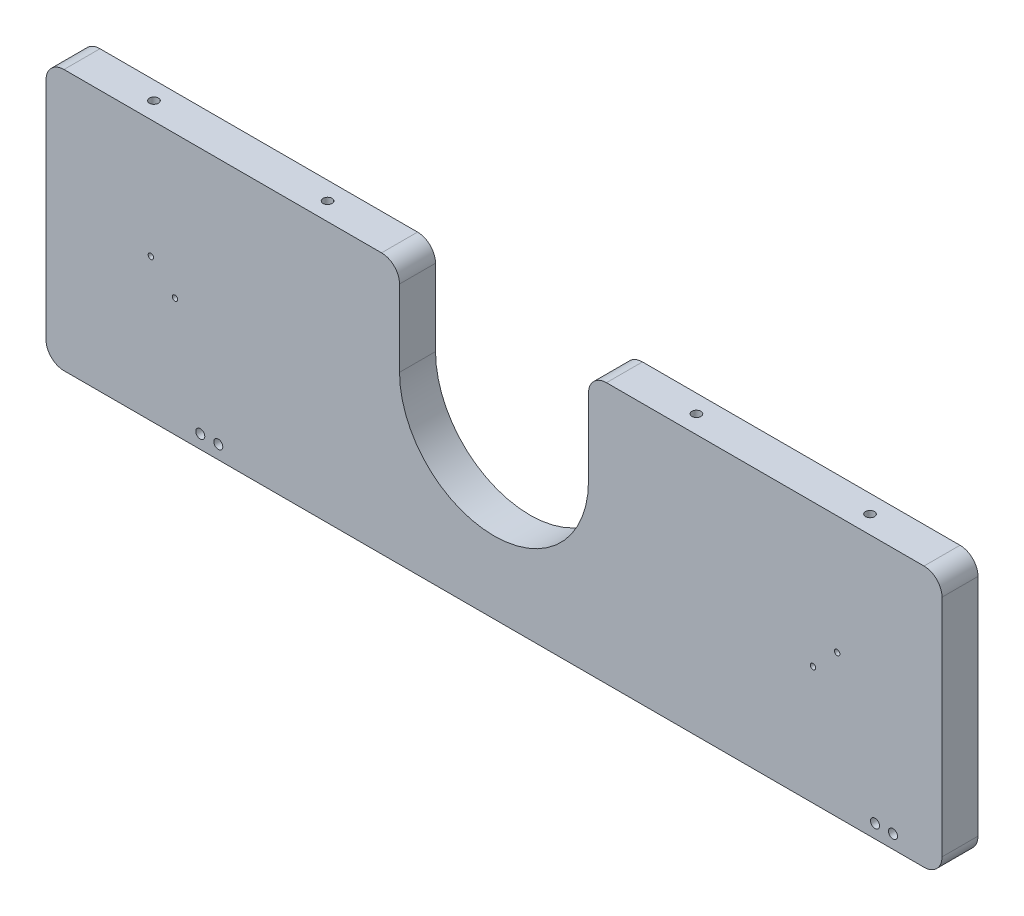
ISO-10303-21;
HEADER;
FILE_DESCRIPTION(('STEP AP214'),'2;1');
FILE_NAME('part.step','',(''),(''),'','','');
FILE_SCHEMA(('AUTOMOTIVE_DESIGN { 1 0 10303 214 1 1 1 1 }'));
ENDSEC;
DATA;
#1=APPLICATION_CONTEXT('core data for automotive mechanical design processes');
#2=APPLICATION_PROTOCOL_DEFINITION('international standard','automotive_design',2000,#1);
#3=PRODUCT_CONTEXT('',#1,'mechanical');
#4=PRODUCT('Part','Part','',(#3));
#5=PRODUCT_RELATED_PRODUCT_CATEGORY('part','',(#4));
#6=PRODUCT_DEFINITION_FORMATION('','',#4);
#7=PRODUCT_DEFINITION_CONTEXT('part definition',#1,'design');
#8=PRODUCT_DEFINITION('design','',#6,#7);
#9=PRODUCT_DEFINITION_SHAPE('','',#8);
#10=(LENGTH_UNIT() NAMED_UNIT(*) SI_UNIT(.MILLI.,.METRE.));
#11=(NAMED_UNIT(*) PLANE_ANGLE_UNIT() SI_UNIT($,.RADIAN.));
#12=(NAMED_UNIT(*) SI_UNIT($,.STERADIAN.) SOLID_ANGLE_UNIT());
#13=UNCERTAINTY_MEASURE_WITH_UNIT(LENGTH_MEASURE(1.E-05),#10,'distance_accuracy_value','');
#14=(GEOMETRIC_REPRESENTATION_CONTEXT(3) GLOBAL_UNCERTAINTY_ASSIGNED_CONTEXT((#13)) GLOBAL_UNIT_ASSIGNED_CONTEXT((#10,
#11,#12)) REPRESENTATION_CONTEXT('',''));
#15=CARTESIAN_POINT('',(0.,0.,0.));
#16=DIRECTION('',(0.,0.,1.));
#17=DIRECTION('',(1.,0.,0.));
#18=AXIS2_PLACEMENT_3D('',#15,#16,#17);
#19=CARTESIAN_POINT('',(0.,-31.7184116529096,20.));
#20=DIRECTION('',(0.,0.,1.));
#21=DIRECTION('',(1.,0.,0.));
#22=AXIS2_PLACEMENT_3D('',#19,#20,#21);
#23=PLANE('',#22);
#24=CARTESIAN_POINT('',(177.282485578728,-58.4359260741818,20.));
#25=DIRECTION('',(0.,0.,1.));
#26=DIRECTION('',(-1.,0.,0.));
#27=AXIS2_PLACEMENT_3D('',#24,#25,#26);
#28=CIRCLE('',#27,1.49999999999999);
#29=CARTESIAN_POINT('',(175.782485578728,-58.4359260741818,20.));
#30=VERTEX_POINT('',#29);
#31=EDGE_CURVE('E322',#30,#30,#28,.T.);
#32=ORIENTED_EDGE('',*,*,#31,.F.);
#33=EDGE_LOOP('',(#32));
#34=FACE_BOUND('',#33,.T.);
#35=CARTESIAN_POINT('',(190.717514421272,-45.0008972316374,20.));
#36=DIRECTION('',(0.,0.,1.));
#37=DIRECTION('',(-1.,0.,0.));
#38=AXIS2_PLACEMENT_3D('',#35,#36,#37);
#39=CIRCLE('',#38,1.50000000000002);
#40=CARTESIAN_POINT('',(189.217514421272,-45.0008972316374,20.));
#41=VERTEX_POINT('',#40);
#42=EDGE_CURVE('E321',#41,#41,#39,.T.);
#43=ORIENTED_EDGE('',*,*,#42,.F.);
#44=EDGE_LOOP('',(#43));
#45=FACE_BOUND('',#44,.T.);
#46=CARTESIAN_POINT('',(-190.717514421272,-45.0008972316375,20.));
#47=DIRECTION('',(0.,0.,1.));
#48=DIRECTION('',(1.,0.,0.));
#49=AXIS2_PLACEMENT_3D('',#46,#47,#48);
#50=CIRCLE('',#49,1.50000000000002);
#51=CARTESIAN_POINT('',(-189.217514421272,-45.0008972316375,20.));
#52=VERTEX_POINT('',#51);
#53=EDGE_CURVE('E329',#52,#52,#50,.T.);
#54=ORIENTED_EDGE('',*,*,#53,.F.);
#55=EDGE_LOOP('',(#54));
#56=FACE_BOUND('',#55,.T.);
#57=CARTESIAN_POINT('',(-177.282485578728,-58.4359260741819,20.));
#58=DIRECTION('',(0.,0.,1.));
#59=DIRECTION('',(1.,0.,0.));
#60=AXIS2_PLACEMENT_3D('',#57,#58,#59);
#61=CIRCLE('',#60,1.49999999999999);
#62=CARTESIAN_POINT('',(-175.782485578728,-58.4359260741819,20.));
#63=VERTEX_POINT('',#62);
#64=EDGE_CURVE('E314',#63,#63,#61,.T.);
#65=ORIENTED_EDGE('',*,*,#64,.F.);
#66=EDGE_LOOP('',(#65));
#67=FACE_BOUND('',#66,.T.);
#68=CARTESIAN_POINT('',(221.75,-116.71841165291,20.));
#69=DIRECTION('',(0.,0.,1.));
#70=DIRECTION('',(1.,0.,0.));
#71=AXIS2_PLACEMENT_3D('',#68,#69,#70);
#72=CIRCLE('',#71,2.5);
#73=CARTESIAN_POINT('',(224.25,-116.71841165291,20.));
#74=VERTEX_POINT('',#73);
#75=EDGE_CURVE('E297',#74,#74,#72,.T.);
#76=ORIENTED_EDGE('',*,*,#75,.F.);
#77=EDGE_LOOP('',(#76));
#78=FACE_BOUND('',#77,.T.);
#79=CARTESIAN_POINT('',(-163.25,-116.71841165291,20.));
#80=DIRECTION('',(0.,0.,1.));
#81=DIRECTION('',(1.,0.,0.));
#82=AXIS2_PLACEMENT_3D('',#79,#80,#81);
#83=CIRCLE('',#82,2.49999999999999);
#84=CARTESIAN_POINT('',(-160.75,-116.71841165291,20.));
#85=VERTEX_POINT('',#84);
#86=EDGE_CURVE('E181',#85,#85,#83,.T.);
#87=ORIENTED_EDGE('',*,*,#86,.F.);
#88=EDGE_LOOP('',(#87));
#89=FACE_BOUND('',#88,.T.);
#90=DIRECTION('',(0.,1.,0.));
#91=VECTOR('',#90,1.);
#92=CARTESIAN_POINT('',(249.,-124.21841165291,20.));
#93=LINE('',#92,#91);
#94=CARTESIAN_POINT('',(249.,-114.21841165291,20.));
#95=VERTEX_POINT('',#94);
#96=CARTESIAN_POINT('',(249.,10.7815883470904,20.));
#97=VERTEX_POINT('',#96);
#98=EDGE_CURVE('E197',#95,#97,#93,.T.);
#99=ORIENTED_EDGE('',*,*,#98,.T.);
#100=CARTESIAN_POINT('',(239.,10.7815883470904,20.));
#101=DIRECTION('',(0.,0.,1.));
#102=DIRECTION('',(1.,0.,0.));
#103=AXIS2_PLACEMENT_3D('',#100,#101,#102);
#104=CIRCLE('',#103,10.);
#105=CARTESIAN_POINT('',(239.,20.7815883470904,20.));
#106=VERTEX_POINT('',#105);
#107=EDGE_CURVE('E237',#97,#106,#104,.T.);
#108=ORIENTED_EDGE('',*,*,#107,.T.);
#109=DIRECTION('',(-1.,0.,0.));
#110=VECTOR('',#109,1.);
#111=CARTESIAN_POINT('',(52.5,20.7815883470904,20.));
#112=LINE('',#111,#110);
#113=CARTESIAN_POINT('',(62.5,20.7815883470904,20.));
#114=VERTEX_POINT('',#113);
#115=EDGE_CURVE('E150',#106,#114,#112,.T.);
#116=ORIENTED_EDGE('',*,*,#115,.T.);
#117=CARTESIAN_POINT('',(62.5,10.7815883470904,20.));
#118=DIRECTION('',(0.,0.,1.));
#119=DIRECTION('',(1.,0.,0.));
#120=AXIS2_PLACEMENT_3D('',#117,#118,#119);
#121=CIRCLE('',#120,10.);
#122=CARTESIAN_POINT('',(52.5,10.7815883470904,20.));
#123=VERTEX_POINT('',#122);
#124=EDGE_CURVE('E146',#114,#123,#121,.T.);
#125=ORIENTED_EDGE('',*,*,#124,.T.);
#126=DIRECTION('',(0.,-1.,0.));
#127=VECTOR('',#126,1.);
#128=CARTESIAN_POINT('',(52.5,-31.7184116529096,20.));
#129=LINE('',#128,#127);
#130=CARTESIAN_POINT('',(52.5,-31.7184116529096,20.));
#131=VERTEX_POINT('',#130);
#132=EDGE_CURVE('E137',#123,#131,#129,.T.);
#133=ORIENTED_EDGE('',*,*,#132,.T.);
#134=CARTESIAN_POINT('',(0.,-31.7184116529096,20.));
#135=DIRECTION('',(0.,0.,-1.));
#136=DIRECTION('',(1.,0.,0.));
#137=AXIS2_PLACEMENT_3D('',#134,#135,#136);
#138=CIRCLE('',#137,52.5);
#139=CARTESIAN_POINT('',(-52.5,-31.7184116529096,20.));
#140=VERTEX_POINT('',#139);
#141=EDGE_CURVE('E142',#131,#140,#138,.T.);
#142=ORIENTED_EDGE('',*,*,#141,.T.);
#143=DIRECTION('',(0.,1.,0.));
#144=VECTOR('',#143,1.);
#145=CARTESIAN_POINT('',(-52.5,-31.7184116529096,20.));
#146=LINE('',#145,#144);
#147=CARTESIAN_POINT('',(-52.5,10.7815883470904,20.));
#148=VERTEX_POINT('',#147);
#149=EDGE_CURVE('E165',#140,#148,#146,.T.);
#150=ORIENTED_EDGE('',*,*,#149,.T.);
#151=CARTESIAN_POINT('',(-62.5,10.7815883470904,20.));
#152=DIRECTION('',(0.,0.,1.));
#153=DIRECTION('',(1.,0.,0.));
#154=AXIS2_PLACEMENT_3D('',#151,#152,#153);
#155=CIRCLE('',#154,10.);
#156=CARTESIAN_POINT('',(-62.5000000000001,20.7815883470904,20.));
#157=VERTEX_POINT('',#156);
#158=EDGE_CURVE('E59',#148,#157,#155,.T.);
#159=ORIENTED_EDGE('',*,*,#158,.T.);
#160=DIRECTION('',(-1.,0.,0.));
#161=VECTOR('',#160,1.);
#162=CARTESIAN_POINT('',(-249.,20.7815883470903,20.));
#163=LINE('',#162,#161);
#164=CARTESIAN_POINT('',(-239.,20.7815883470903,20.));
#165=VERTEX_POINT('',#164);
#166=EDGE_CURVE('E167',#157,#165,#163,.T.);
#167=ORIENTED_EDGE('',*,*,#166,.T.);
#168=CARTESIAN_POINT('',(-239.,10.7815883470903,20.));
#169=DIRECTION('',(0.,0.,1.));
#170=DIRECTION('',(1.,0.,0.));
#171=AXIS2_PLACEMENT_3D('',#168,#169,#170);
#172=CIRCLE('',#171,10.);
#173=CARTESIAN_POINT('',(-249.,10.7815883470903,20.));
#174=VERTEX_POINT('',#173);
#175=EDGE_CURVE('E235',#165,#174,#172,.T.);
#176=ORIENTED_EDGE('',*,*,#175,.T.);
#177=DIRECTION('',(0.,-1.,0.));
#178=VECTOR('',#177,1.);
#179=CARTESIAN_POINT('',(-249.,-124.21841165291,20.));
#180=LINE('',#179,#178);
#181=CARTESIAN_POINT('',(-249.,-114.21841165291,20.));
#182=VERTEX_POINT('',#181);
#183=EDGE_CURVE('E172',#174,#182,#180,.T.);
#184=ORIENTED_EDGE('',*,*,#183,.T.);
#185=CARTESIAN_POINT('',(-239.,-114.21841165291,20.));
#186=DIRECTION('',(0.,0.,1.));
#187=DIRECTION('',(1.,0.,0.));
#188=AXIS2_PLACEMENT_3D('',#185,#186,#187);
#189=CIRCLE('',#188,10.);
#190=CARTESIAN_POINT('',(-239.,-124.21841165291,20.));
#191=VERTEX_POINT('',#190);
#192=EDGE_CURVE('E213',#182,#191,#189,.T.);
#193=ORIENTED_EDGE('',*,*,#192,.T.);
#194=DIRECTION('',(1.,0.,0.));
#195=VECTOR('',#194,1.);
#196=CARTESIAN_POINT('',(-249.,-124.21841165291,20.));
#197=LINE('',#196,#195);
#198=CARTESIAN_POINT('',(239.,-124.21841165291,20.));
#199=VERTEX_POINT('',#198);
#200=EDGE_CURVE('E174',#191,#199,#197,.T.);
#201=ORIENTED_EDGE('',*,*,#200,.T.);
#202=CARTESIAN_POINT('',(239.,-114.21841165291,20.));
#203=DIRECTION('',(0.,0.,1.));
#204=DIRECTION('',(1.,0.,0.));
#205=AXIS2_PLACEMENT_3D('',#202,#203,#204);
#206=CIRCLE('',#205,10.);
#207=EDGE_CURVE('E211',#199,#95,#206,.T.);
#208=ORIENTED_EDGE('',*,*,#207,.T.);
#209=EDGE_LOOP('',(#99,#108,#116,#125,#133,#142,#150,#159,#167,#176,#184,#193,#201,#208));
#210=FACE_BOUND('',#209,.T.);
#211=CARTESIAN_POINT('',(-153.25,-116.71841165291,20.));
#212=DIRECTION('',(0.,0.,1.));
#213=DIRECTION('',(1.,0.,0.));
#214=AXIS2_PLACEMENT_3D('',#211,#212,#213);
#215=CIRCLE('',#214,2.5);
#216=CARTESIAN_POINT('',(-150.75,-116.71841165291,20.));
#217=VERTEX_POINT('',#216);
#218=EDGE_CURVE('E291',#217,#217,#215,.T.);
#219=ORIENTED_EDGE('',*,*,#218,.F.);
#220=EDGE_LOOP('',(#219));
#221=FACE_BOUND('',#220,.T.);
#222=CARTESIAN_POINT('',(211.75,-116.71841165291,20.));
#223=DIRECTION('',(0.,0.,1.));
#224=DIRECTION('',(1.,0.,0.));
#225=AXIS2_PLACEMENT_3D('',#222,#223,#224);
#226=CIRCLE('',#225,2.5);
#227=CARTESIAN_POINT('',(214.25,-116.71841165291,20.));
#228=VERTEX_POINT('',#227);
#229=EDGE_CURVE('E303',#228,#228,#226,.T.);
#230=ORIENTED_EDGE('',*,*,#229,.F.);
#231=EDGE_LOOP('',(#230));
#232=FACE_BOUND('',#231,.T.);
#233=ADVANCED_FACE('F37',(#34,#45,#56,#67,#78,#89,#210,#221,#232),#23,.T.);
#234=CARTESIAN_POINT('',(0.,-31.7184116529096,0.));
#235=DIRECTION('',(0.,0.,1.));
#236=DIRECTION('',(1.,0.,0.));
#237=AXIS2_PLACEMENT_3D('',#234,#235,#236);
#238=PLANE('',#237);
#239=CARTESIAN_POINT('',(177.282485578728,-58.4359260741818,0.));
#240=DIRECTION('',(0.,0.,1.));
#241=DIRECTION('',(1.,0.,0.));
#242=AXIS2_PLACEMENT_3D('',#239,#240,#241);
#243=CIRCLE('',#242,1.49999999999999);
#244=CARTESIAN_POINT('',(178.782485578728,-58.4359260741818,0.));
#245=VERTEX_POINT('',#244);
#246=EDGE_CURVE('E318',#245,#245,#243,.F.);
#247=ORIENTED_EDGE('',*,*,#246,.F.);
#248=EDGE_LOOP('',(#247));
#249=FACE_BOUND('',#248,.T.);
#250=CARTESIAN_POINT('',(190.717514421272,-45.0008972316374,0.));
#251=DIRECTION('',(0.,0.,1.));
#252=DIRECTION('',(1.,0.,0.));
#253=AXIS2_PLACEMENT_3D('',#250,#251,#252);
#254=CIRCLE('',#253,1.50000000000002);
#255=CARTESIAN_POINT('',(192.217514421272,-45.0008972316374,0.));
#256=VERTEX_POINT('',#255);
#257=EDGE_CURVE('E326',#256,#256,#254,.F.);
#258=ORIENTED_EDGE('',*,*,#257,.F.);
#259=EDGE_LOOP('',(#258));
#260=FACE_BOUND('',#259,.T.);
#261=CARTESIAN_POINT('',(-190.717514421272,-45.0008972316375,0.));
#262=DIRECTION('',(0.,0.,1.));
#263=DIRECTION('',(1.,0.,0.));
#264=AXIS2_PLACEMENT_3D('',#261,#262,#263);
#265=CIRCLE('',#264,1.50000000000002);
#266=CARTESIAN_POINT('',(-189.217514421272,-45.0008972316375,0.));
#267=VERTEX_POINT('',#266);
#268=EDGE_CURVE('E317',#267,#267,#265,.F.);
#269=ORIENTED_EDGE('',*,*,#268,.F.);
#270=EDGE_LOOP('',(#269));
#271=FACE_BOUND('',#270,.T.);
#272=CARTESIAN_POINT('',(-177.282485578728,-58.4359260741819,0.));
#273=DIRECTION('',(0.,0.,1.));
#274=DIRECTION('',(1.,0.,0.));
#275=AXIS2_PLACEMENT_3D('',#272,#273,#274);
#276=CIRCLE('',#275,1.49999999999999);
#277=CARTESIAN_POINT('',(-175.782485578728,-58.4359260741819,0.));
#278=VERTEX_POINT('',#277);
#279=EDGE_CURVE('E309',#278,#278,#276,.F.);
#280=ORIENTED_EDGE('',*,*,#279,.F.);
#281=EDGE_LOOP('',(#280));
#282=FACE_BOUND('',#281,.T.);
#283=DIRECTION('',(-1.,0.,0.));
#284=VECTOR('',#283,1.);
#285=CARTESIAN_POINT('',(52.5,20.7815883470904,0.));
#286=LINE('',#285,#284);
#287=CARTESIAN_POINT('',(239.,20.7815883470904,0.));
#288=VERTEX_POINT('',#287);
#289=CARTESIAN_POINT('',(62.5,20.7815883470904,0.));
#290=VERTEX_POINT('',#289);
#291=EDGE_CURVE('E180',#288,#290,#286,.T.);
#292=ORIENTED_EDGE('',*,*,#291,.F.);
#293=CARTESIAN_POINT('',(239.,10.7815883470904,0.));
#294=DIRECTION('',(0.,0.,1.));
#295=DIRECTION('',(1.,0.,0.));
#296=AXIS2_PLACEMENT_3D('',#293,#294,#295);
#297=CIRCLE('',#296,10.);
#298=CARTESIAN_POINT('',(249.,10.7815883470904,0.));
#299=VERTEX_POINT('',#298);
#300=EDGE_CURVE('E229',#288,#299,#297,.F.);
#301=ORIENTED_EDGE('',*,*,#300,.T.);
#302=DIRECTION('',(0.,1.,0.));
#303=VECTOR('',#302,1.);
#304=CARTESIAN_POINT('',(249.,-124.21841165291,0.));
#305=LINE('',#304,#303);
#306=CARTESIAN_POINT('',(249.,-114.21841165291,0.));
#307=VERTEX_POINT('',#306);
#308=EDGE_CURVE('E177',#307,#299,#305,.T.);
#309=ORIENTED_EDGE('',*,*,#308,.F.);
#310=CARTESIAN_POINT('',(239.,-114.21841165291,0.));
#311=DIRECTION('',(0.,0.,1.));
#312=DIRECTION('',(1.,0.,0.));
#313=AXIS2_PLACEMENT_3D('',#310,#311,#312);
#314=CIRCLE('',#313,10.);
#315=CARTESIAN_POINT('',(239.,-124.21841165291,0.));
#316=VERTEX_POINT('',#315);
#317=EDGE_CURVE('E203',#307,#316,#314,.F.);
#318=ORIENTED_EDGE('',*,*,#317,.T.);
#319=DIRECTION('',(1.,0.,0.));
#320=VECTOR('',#319,1.);
#321=CARTESIAN_POINT('',(-249.,-124.21841165291,0.));
#322=LINE('',#321,#320);
#323=CARTESIAN_POINT('',(-239.,-124.21841165291,0.));
#324=VERTEX_POINT('',#323);
#325=EDGE_CURVE('E194',#324,#316,#322,.T.);
#326=ORIENTED_EDGE('',*,*,#325,.F.);
#327=CARTESIAN_POINT('',(-239.,-114.21841165291,0.));
#328=DIRECTION('',(0.,0.,1.));
#329=DIRECTION('',(1.,0.,0.));
#330=AXIS2_PLACEMENT_3D('',#327,#328,#329);
#331=CIRCLE('',#330,10.);
#332=CARTESIAN_POINT('',(-249.,-114.21841165291,0.));
#333=VERTEX_POINT('',#332);
#334=EDGE_CURVE('E205',#324,#333,#331,.F.);
#335=ORIENTED_EDGE('',*,*,#334,.T.);
#336=DIRECTION('',(0.,-1.,0.));
#337=VECTOR('',#336,1.);
#338=CARTESIAN_POINT('',(-249.,-124.21841165291,0.));
#339=LINE('',#338,#337);
#340=CARTESIAN_POINT('',(-249.,10.7815883470903,0.));
#341=VERTEX_POINT('',#340);
#342=EDGE_CURVE('E192',#341,#333,#339,.T.);
#343=ORIENTED_EDGE('',*,*,#342,.F.);
#344=CARTESIAN_POINT('',(-239.,10.7815883470903,0.));
#345=DIRECTION('',(0.,0.,1.));
#346=DIRECTION('',(1.,0.,0.));
#347=AXIS2_PLACEMENT_3D('',#344,#345,#346);
#348=CIRCLE('',#347,10.);
#349=CARTESIAN_POINT('',(-239.,20.7815883470903,0.));
#350=VERTEX_POINT('',#349);
#351=EDGE_CURVE('E227',#341,#350,#348,.F.);
#352=ORIENTED_EDGE('',*,*,#351,.T.);
#353=DIRECTION('',(-1.,0.,0.));
#354=VECTOR('',#353,1.);
#355=CARTESIAN_POINT('',(-249.,20.7815883470903,0.));
#356=LINE('',#355,#354);
#357=CARTESIAN_POINT('',(-62.5000000000001,20.7815883470904,0.));
#358=VERTEX_POINT('',#357);
#359=EDGE_CURVE('E190',#358,#350,#356,.T.);
#360=ORIENTED_EDGE('',*,*,#359,.F.);
#361=CARTESIAN_POINT('',(-62.5,10.7815883470904,0.));
#362=DIRECTION('',(0.,0.,1.));
#363=DIRECTION('',(1.,0.,0.));
#364=AXIS2_PLACEMENT_3D('',#361,#362,#363);
#365=CIRCLE('',#364,10.);
#366=CARTESIAN_POINT('',(-52.5,10.7815883470904,0.));
#367=VERTEX_POINT('',#366);
#368=EDGE_CURVE('E223',#358,#367,#365,.F.);
#369=ORIENTED_EDGE('',*,*,#368,.T.);
#370=DIRECTION('',(0.,1.,0.));
#371=VECTOR('',#370,1.);
#372=CARTESIAN_POINT('',(-52.5,-31.7184116529096,0.));
#373=LINE('',#372,#371);
#374=CARTESIAN_POINT('',(-52.5,-31.7184116529096,0.));
#375=VERTEX_POINT('',#374);
#376=EDGE_CURVE('E187',#375,#367,#373,.T.);
#377=ORIENTED_EDGE('',*,*,#376,.F.);
#378=CARTESIAN_POINT('',(0.,-31.7184116529096,0.));
#379=DIRECTION('',(0.,0.,-1.));
#380=DIRECTION('',(1.,0.,0.));
#381=AXIS2_PLACEMENT_3D('',#378,#379,#380);
#382=CIRCLE('',#381,52.5);
#383=CARTESIAN_POINT('',(52.5,-31.7184116529096,0.));
#384=VERTEX_POINT('',#383);
#385=EDGE_CURVE('E185',#384,#375,#382,.T.);
#386=ORIENTED_EDGE('',*,*,#385,.F.);
#387=DIRECTION('',(0.,-1.,0.));
#388=VECTOR('',#387,1.);
#389=CARTESIAN_POINT('',(52.5,-31.7184116529096,0.));
#390=LINE('',#389,#388);
#391=CARTESIAN_POINT('',(52.5,10.7815883470904,0.));
#392=VERTEX_POINT('',#391);
#393=EDGE_CURVE('E156',#392,#384,#390,.T.);
#394=ORIENTED_EDGE('',*,*,#393,.F.);
#395=CARTESIAN_POINT('',(62.5,10.7815883470904,0.));
#396=DIRECTION('',(0.,0.,1.));
#397=DIRECTION('',(1.,0.,0.));
#398=AXIS2_PLACEMENT_3D('',#395,#396,#397);
#399=CIRCLE('',#398,10.);
#400=EDGE_CURVE('E225',#392,#290,#399,.F.);
#401=ORIENTED_EDGE('',*,*,#400,.T.);
#402=EDGE_LOOP('',(#292,#301,#309,#318,#326,#335,#343,#352,#360,#369,#377,#386,#394,#401));
#403=FACE_BOUND('',#402,.T.);
#404=CARTESIAN_POINT('',(-163.25,-116.71841165291,0.));
#405=DIRECTION('',(0.,0.,1.));
#406=DIRECTION('',(1.,0.,0.));
#407=AXIS2_PLACEMENT_3D('',#404,#405,#406);
#408=CIRCLE('',#407,2.49999999999999);
#409=CARTESIAN_POINT('',(-160.75,-116.71841165291,0.));
#410=VERTEX_POINT('',#409);
#411=EDGE_CURVE('E288',#410,#410,#408,.T.);
#412=ORIENTED_EDGE('',*,*,#411,.T.);
#413=EDGE_LOOP('',(#412));
#414=FACE_BOUND('',#413,.T.);
#415=CARTESIAN_POINT('',(-153.25,-116.71841165291,0.));
#416=DIRECTION('',(0.,0.,1.));
#417=DIRECTION('',(1.,0.,0.));
#418=AXIS2_PLACEMENT_3D('',#415,#416,#417);
#419=CIRCLE('',#418,2.5);
#420=CARTESIAN_POINT('',(-150.75,-116.71841165291,0.));
#421=VERTEX_POINT('',#420);
#422=EDGE_CURVE('E294',#421,#421,#419,.T.);
#423=ORIENTED_EDGE('',*,*,#422,.T.);
#424=EDGE_LOOP('',(#423));
#425=FACE_BOUND('',#424,.T.);
#426=CARTESIAN_POINT('',(221.75,-116.71841165291,0.));
#427=DIRECTION('',(0.,0.,1.));
#428=DIRECTION('',(1.,0.,0.));
#429=AXIS2_PLACEMENT_3D('',#426,#427,#428);
#430=CIRCLE('',#429,2.5);
#431=CARTESIAN_POINT('',(224.25,-116.71841165291,0.));
#432=VERTEX_POINT('',#431);
#433=EDGE_CURVE('E300',#432,#432,#430,.T.);
#434=ORIENTED_EDGE('',*,*,#433,.T.);
#435=EDGE_LOOP('',(#434));
#436=FACE_BOUND('',#435,.T.);
#437=CARTESIAN_POINT('',(211.75,-116.71841165291,0.));
#438=DIRECTION('',(0.,0.,1.));
#439=DIRECTION('',(1.,0.,0.));
#440=AXIS2_PLACEMENT_3D('',#437,#438,#439);
#441=CIRCLE('',#440,2.5);
#442=CARTESIAN_POINT('',(214.25,-116.71841165291,0.));
#443=VERTEX_POINT('',#442);
#444=EDGE_CURVE('E306',#443,#443,#441,.T.);
#445=ORIENTED_EDGE('',*,*,#444,.T.);
#446=EDGE_LOOP('',(#445));
#447=FACE_BOUND('',#446,.T.);
#448=ADVANCED_FACE('F248',(#249,#260,#271,#282,#403,#414,#425,#436,#447),#238,.F.);
#449=CARTESIAN_POINT('',(249.,-124.21841165291,20.));
#450=DIRECTION('',(-1.,0.,0.));
#451=DIRECTION('',(0.,0.,1.));
#452=AXIS2_PLACEMENT_3D('',#449,#450,#451);
#453=PLANE('',#452);
#454=ORIENTED_EDGE('',*,*,#308,.T.);
#455=DIRECTION('',(0.,0.,-1.));
#456=VECTOR('',#455,1.);
#457=CARTESIAN_POINT('',(249.,10.7815883470904,20.));
#458=LINE('',#457,#456);
#459=EDGE_CURVE('E231',#299,#97,#458,.F.);
#460=ORIENTED_EDGE('',*,*,#459,.T.);
#461=ORIENTED_EDGE('',*,*,#98,.F.);
#462=DIRECTION('',(0.,0.,-1.));
#463=VECTOR('',#462,1.);
#464=CARTESIAN_POINT('',(249.,-114.21841165291,20.));
#465=LINE('',#464,#463);
#466=EDGE_CURVE('E215',#95,#307,#465,.T.);
#467=ORIENTED_EDGE('',*,*,#466,.T.);
#468=EDGE_LOOP('',(#454,#460,#461,#467));
#469=FACE_BOUND('',#468,.T.);
#470=ADVANCED_FACE('F284',(#469),#453,.F.);
#471=CARTESIAN_POINT('',(52.5,20.7815883470904,20.));
#472=DIRECTION('',(0.,-1.,0.));
#473=DIRECTION('',(1.,0.,0.));
#474=AXIS2_PLACEMENT_3D('',#471,#472,#473);
#475=PLANE('',#474);
#476=CARTESIAN_POINT('',(102.5,20.7815883470904,10.0000000000002));
#477=DIRECTION('',(0.,1.,0.));
#478=DIRECTION('',(1.,0.,0.));
#479=AXIS2_PLACEMENT_3D('',#476,#477,#478);
#480=CIRCLE('',#479,2.5);
#481=CARTESIAN_POINT('',(105.,20.7815883470904,10.0000000000002));
#482=VERTEX_POINT('',#481);
#483=EDGE_CURVE('E342',#482,#482,#480,.T.);
#484=ORIENTED_EDGE('',*,*,#483,.F.);
#485=EDGE_LOOP('',(#484));
#486=FACE_BOUND('',#485,.T.);
#487=CARTESIAN_POINT('',(199.,20.7815883470904,10.0000000000004));
#488=DIRECTION('',(0.,1.,0.));
#489=DIRECTION('',(1.,0.,0.));
#490=AXIS2_PLACEMENT_3D('',#487,#488,#489);
#491=CIRCLE('',#490,2.5);
#492=CARTESIAN_POINT('',(201.5,20.7815883470904,10.0000000000004));
#493=VERTEX_POINT('',#492);
#494=EDGE_CURVE('E336',#493,#493,#491,.T.);
#495=ORIENTED_EDGE('',*,*,#494,.F.);
#496=EDGE_LOOP('',(#495));
#497=FACE_BOUND('',#496,.T.);
#498=ORIENTED_EDGE('',*,*,#115,.F.);
#499=DIRECTION('',(0.,0.,-1.));
#500=VECTOR('',#499,1.);
#501=CARTESIAN_POINT('',(239.,20.7815883470904,20.));
#502=LINE('',#501,#500);
#503=EDGE_CURVE('E220',#106,#288,#502,.T.);
#504=ORIENTED_EDGE('',*,*,#503,.T.);
#505=ORIENTED_EDGE('',*,*,#291,.T.);
#506=DIRECTION('',(0.,0.,-1.));
#507=VECTOR('',#506,1.);
#508=CARTESIAN_POINT('',(62.5,20.7815883470904,20.));
#509=LINE('',#508,#507);
#510=EDGE_CURVE('E218',#290,#114,#509,.F.);
#511=ORIENTED_EDGE('',*,*,#510,.T.);
#512=EDGE_LOOP('',(#498,#504,#505,#511));
#513=FACE_BOUND('',#512,.T.);
#514=ADVANCED_FACE('F414',(#486,#497,#513),#475,.F.);
#515=CARTESIAN_POINT('',(52.5,-31.7184116529096,20.));
#516=DIRECTION('',(1.,0.,0.));
#517=DIRECTION('',(0.,1.,0.));
#518=AXIS2_PLACEMENT_3D('',#515,#516,#517);
#519=PLANE('',#518);
#520=ORIENTED_EDGE('',*,*,#132,.F.);
#521=DIRECTION('',(0.,0.,-1.));
#522=VECTOR('',#521,1.);
#523=CARTESIAN_POINT('',(52.5,10.7815883470904,20.));
#524=LINE('',#523,#522);
#525=EDGE_CURVE('E45',#123,#392,#524,.T.);
#526=ORIENTED_EDGE('',*,*,#525,.T.);
#527=ORIENTED_EDGE('',*,*,#393,.T.);
#528=DIRECTION('',(0.,0.,-1.));
#529=VECTOR('',#528,1.);
#530=CARTESIAN_POINT('',(52.5,-31.7184116529096,20.));
#531=LINE('',#530,#529);
#532=EDGE_CURVE('E153',#131,#384,#531,.T.);
#533=ORIENTED_EDGE('',*,*,#532,.F.);
#534=EDGE_LOOP('',(#520,#526,#527,#533));
#535=FACE_BOUND('',#534,.T.);
#536=ADVANCED_FACE('F154',(#535),#519,.F.);
#537=CARTESIAN_POINT('',(0.,-31.7184116529096,20.));
#538=DIRECTION('',(0.,0.,-1.));
#539=DIRECTION('',(-1.,0.,0.));
#540=AXIS2_PLACEMENT_3D('',#537,#538,#539);
#541=CYLINDRICAL_SURFACE('',#540,52.5);
#542=ORIENTED_EDGE('',*,*,#385,.T.);
#543=DIRECTION('',(0.,0.,-1.));
#544=VECTOR('',#543,1.);
#545=CARTESIAN_POINT('',(-52.5,-31.7184116529096,20.));
#546=LINE('',#545,#544);
#547=EDGE_CURVE('E160',#140,#375,#546,.T.);
#548=ORIENTED_EDGE('',*,*,#547,.F.);
#549=ORIENTED_EDGE('',*,*,#141,.F.);
#550=ORIENTED_EDGE('',*,*,#532,.T.);
#551=EDGE_LOOP('',(#542,#548,#549,#550));
#552=FACE_BOUND('',#551,.T.);
#553=ADVANCED_FACE('F162',(#552),#541,.F.);
#554=CARTESIAN_POINT('',(-52.5,-31.7184116529096,20.));
#555=DIRECTION('',(-1.,0.,0.));
#556=DIRECTION('',(0.,0.,1.));
#557=AXIS2_PLACEMENT_3D('',#554,#555,#556);
#558=PLANE('',#557);
#559=ORIENTED_EDGE('',*,*,#376,.T.);
#560=DIRECTION('',(0.,0.,-1.));
#561=VECTOR('',#560,1.);
#562=CARTESIAN_POINT('',(-52.5,10.7815883470904,20.));
#563=LINE('',#562,#561);
#564=EDGE_CURVE('E11',#367,#148,#563,.F.);
#565=ORIENTED_EDGE('',*,*,#564,.T.);
#566=ORIENTED_EDGE('',*,*,#149,.F.);
#567=ORIENTED_EDGE('',*,*,#547,.T.);
#568=EDGE_LOOP('',(#559,#565,#566,#567));
#569=FACE_BOUND('',#568,.T.);
#570=ADVANCED_FACE('F252',(#569),#558,.F.);
#571=CARTESIAN_POINT('',(-249.,20.7815883470903,20.));
#572=DIRECTION('',(0.,-1.,0.));
#573=DIRECTION('',(1.,0.,0.));
#574=AXIS2_PLACEMENT_3D('',#571,#572,#573);
#575=PLANE('',#574);
#576=CARTESIAN_POINT('',(-199.,20.7815883470903,10.));
#577=DIRECTION('',(0.,1.,0.));
#578=DIRECTION('',(-1.,0.,0.));
#579=AXIS2_PLACEMENT_3D('',#576,#577,#578);
#580=CIRCLE('',#579,2.5);
#581=CARTESIAN_POINT('',(-201.5,20.7815883470903,10.));
#582=VERTEX_POINT('',#581);
#583=EDGE_CURVE('E354',#582,#582,#580,.T.);
#584=ORIENTED_EDGE('',*,*,#583,.F.);
#585=EDGE_LOOP('',(#584));
#586=FACE_BOUND('',#585,.T.);
#587=CARTESIAN_POINT('',(-102.5,20.7815883470903,10.));
#588=DIRECTION('',(0.,1.,0.));
#589=DIRECTION('',(-1.,0.,0.));
#590=AXIS2_PLACEMENT_3D('',#587,#588,#589);
#591=CIRCLE('',#590,2.49999999999999);
#592=CARTESIAN_POINT('',(-105.,20.7815883470903,10.));
#593=VERTEX_POINT('',#592);
#594=EDGE_CURVE('E348',#593,#593,#591,.T.);
#595=ORIENTED_EDGE('',*,*,#594,.F.);
#596=EDGE_LOOP('',(#595));
#597=FACE_BOUND('',#596,.T.);
#598=ORIENTED_EDGE('',*,*,#359,.T.);
#599=DIRECTION('',(0.,0.,-1.));
#600=VECTOR('',#599,1.);
#601=CARTESIAN_POINT('',(-239.,20.7815883470903,20.));
#602=LINE('',#601,#600);
#603=EDGE_CURVE('E52',#350,#165,#602,.F.);
#604=ORIENTED_EDGE('',*,*,#603,.T.);
#605=ORIENTED_EDGE('',*,*,#166,.F.);
#606=DIRECTION('',(0.,0.,-1.));
#607=VECTOR('',#606,1.);
#608=CARTESIAN_POINT('',(-62.5,20.7815883470904,20.));
#609=LINE('',#608,#607);
#610=EDGE_CURVE('E242',#157,#358,#609,.T.);
#611=ORIENTED_EDGE('',*,*,#610,.T.);
#612=EDGE_LOOP('',(#598,#604,#605,#611));
#613=FACE_BOUND('',#612,.T.);
#614=ADVANCED_FACE('F257',(#586,#597,#613),#575,.F.);
#615=CARTESIAN_POINT('',(-249.,-124.21841165291,20.));
#616=DIRECTION('',(1.,0.,0.));
#617=DIRECTION('',(0.,0.,-1.));
#618=AXIS2_PLACEMENT_3D('',#615,#616,#617);
#619=PLANE('',#618);
#620=ORIENTED_EDGE('',*,*,#183,.F.);
#621=DIRECTION('',(0.,0.,-1.));
#622=VECTOR('',#621,1.);
#623=CARTESIAN_POINT('',(-249.,10.7815883470903,20.));
#624=LINE('',#623,#622);
#625=EDGE_CURVE('E239',#174,#341,#624,.T.);
#626=ORIENTED_EDGE('',*,*,#625,.T.);
#627=ORIENTED_EDGE('',*,*,#342,.T.);
#628=DIRECTION('',(0.,0.,-1.));
#629=VECTOR('',#628,1.);
#630=CARTESIAN_POINT('',(-249.,-114.21841165291,20.));
#631=LINE('',#630,#629);
#632=EDGE_CURVE('E208',#333,#182,#631,.F.);
#633=ORIENTED_EDGE('',*,*,#632,.T.);
#634=EDGE_LOOP('',(#620,#626,#627,#633));
#635=FACE_BOUND('',#634,.T.);
#636=ADVANCED_FACE('F265',(#635),#619,.F.);
#637=CARTESIAN_POINT('',(-249.,-124.21841165291,20.));
#638=DIRECTION('',(0.,1.,0.));
#639=DIRECTION('',(0.,0.,1.));
#640=AXIS2_PLACEMENT_3D('',#637,#638,#639);
#641=PLANE('',#640);
#642=ORIENTED_EDGE('',*,*,#200,.F.);
#643=DIRECTION('',(0.,0.,-1.));
#644=VECTOR('',#643,1.);
#645=CARTESIAN_POINT('',(-239.,-124.21841165291,20.));
#646=LINE('',#645,#644);
#647=EDGE_CURVE('E200',#191,#324,#646,.T.);
#648=ORIENTED_EDGE('',*,*,#647,.T.);
#649=ORIENTED_EDGE('',*,*,#325,.T.);
#650=DIRECTION('',(0.,0.,-1.));
#651=VECTOR('',#650,1.);
#652=CARTESIAN_POINT('',(239.,-124.21841165291,20.));
#653=LINE('',#652,#651);
#654=EDGE_CURVE('E159',#316,#199,#653,.F.);
#655=ORIENTED_EDGE('',*,*,#654,.T.);
#656=EDGE_LOOP('',(#642,#648,#649,#655));
#657=FACE_BOUND('',#656,.T.);
#658=ADVANCED_FACE('F273',(#657),#641,.F.);
#659=CARTESIAN_POINT('',(-163.25,-116.71841165291,20.));
#660=DIRECTION('',(0.,0.,-1.));
#661=DIRECTION('',(-1.,0.,0.));
#662=AXIS2_PLACEMENT_3D('',#659,#660,#661);
#663=CYLINDRICAL_SURFACE('',#662,2.49999999999999);
#664=ORIENTED_EDGE('',*,*,#86,.T.);
#665=EDGE_LOOP('',(#664));
#666=FACE_BOUND('',#665,.T.);
#667=ORIENTED_EDGE('',*,*,#411,.F.);
#668=EDGE_LOOP('',(#667));
#669=FACE_BOUND('',#668,.T.);
#670=ADVANCED_FACE('F401',(#666,#669),#663,.F.);
#671=CARTESIAN_POINT('',(-153.25,-116.71841165291,20.));
#672=DIRECTION('',(0.,0.,-1.));
#673=DIRECTION('',(-1.,0.,0.));
#674=AXIS2_PLACEMENT_3D('',#671,#672,#673);
#675=CYLINDRICAL_SURFACE('',#674,2.5);
#676=ORIENTED_EDGE('',*,*,#218,.T.);
#677=EDGE_LOOP('',(#676));
#678=FACE_BOUND('',#677,.T.);
#679=ORIENTED_EDGE('',*,*,#422,.F.);
#680=EDGE_LOOP('',(#679));
#681=FACE_BOUND('',#680,.T.);
#682=ADVANCED_FACE('F641',(#678,#681),#675,.F.);
#683=CARTESIAN_POINT('',(221.75,-116.71841165291,20.));
#684=DIRECTION('',(0.,0.,-1.));
#685=DIRECTION('',(-1.,0.,0.));
#686=AXIS2_PLACEMENT_3D('',#683,#684,#685);
#687=CYLINDRICAL_SURFACE('',#686,2.5);
#688=ORIENTED_EDGE('',*,*,#75,.T.);
#689=EDGE_LOOP('',(#688));
#690=FACE_BOUND('',#689,.T.);
#691=ORIENTED_EDGE('',*,*,#433,.F.);
#692=EDGE_LOOP('',(#691));
#693=FACE_BOUND('',#692,.T.);
#694=ADVANCED_FACE('F631',(#690,#693),#687,.F.);
#695=CARTESIAN_POINT('',(211.75,-116.71841165291,20.));
#696=DIRECTION('',(0.,0.,-1.));
#697=DIRECTION('',(-1.,0.,0.));
#698=AXIS2_PLACEMENT_3D('',#695,#696,#697);
#699=CYLINDRICAL_SURFACE('',#698,2.5);
#700=ORIENTED_EDGE('',*,*,#229,.T.);
#701=EDGE_LOOP('',(#700));
#702=FACE_BOUND('',#701,.T.);
#703=ORIENTED_EDGE('',*,*,#444,.F.);
#704=EDGE_LOOP('',(#703));
#705=FACE_BOUND('',#704,.T.);
#706=ADVANCED_FACE('F422',(#702,#705),#699,.F.);
#707=CARTESIAN_POINT('',(-239.,-114.21841165291,20.));
#708=DIRECTION('',(0.,0.,-1.));
#709=DIRECTION('',(-1.,0.,0.));
#710=AXIS2_PLACEMENT_3D('',#707,#708,#709);
#711=CYLINDRICAL_SURFACE('',#710,10.);
#712=ORIENTED_EDGE('',*,*,#192,.F.);
#713=ORIENTED_EDGE('',*,*,#632,.F.);
#714=ORIENTED_EDGE('',*,*,#334,.F.);
#715=ORIENTED_EDGE('',*,*,#647,.F.);
#716=EDGE_LOOP('',(#712,#713,#714,#715));
#717=FACE_BOUND('',#716,.T.);
#718=ADVANCED_FACE('F276',(#717),#711,.T.);
#719=CARTESIAN_POINT('',(239.,-114.21841165291,20.));
#720=DIRECTION('',(0.,0.,-1.));
#721=DIRECTION('',(-1.,0.,0.));
#722=AXIS2_PLACEMENT_3D('',#719,#720,#721);
#723=CYLINDRICAL_SURFACE('',#722,10.);
#724=ORIENTED_EDGE('',*,*,#207,.F.);
#725=ORIENTED_EDGE('',*,*,#654,.F.);
#726=ORIENTED_EDGE('',*,*,#317,.F.);
#727=ORIENTED_EDGE('',*,*,#466,.F.);
#728=EDGE_LOOP('',(#724,#725,#726,#727));
#729=FACE_BOUND('',#728,.T.);
#730=ADVANCED_FACE('F279',(#729),#723,.T.);
#731=CARTESIAN_POINT('',(-177.282485578728,-58.4359260741819,-4.24264068711936));
#732=DIRECTION('',(0.,0.,1.));
#733=DIRECTION('',(1.,0.,0.));
#734=AXIS2_PLACEMENT_3D('',#731,#732,#733);
#735=CYLINDRICAL_SURFACE('',#734,1.49999999999999);
#736=ORIENTED_EDGE('',*,*,#279,.T.);
#737=EDGE_LOOP('',(#736));
#738=FACE_BOUND('',#737,.T.);
#739=ORIENTED_EDGE('',*,*,#64,.T.);
#740=EDGE_LOOP('',(#739));
#741=FACE_BOUND('',#740,.T.);
#742=ADVANCED_FACE('F425',(#738,#741),#735,.F.);
#743=CARTESIAN_POINT('',(-190.717514421272,-45.0008972316375,-4.24264068711936));
#744=DIRECTION('',(0.,0.,1.));
#745=DIRECTION('',(1.,0.,0.));
#746=AXIS2_PLACEMENT_3D('',#743,#744,#745);
#747=CYLINDRICAL_SURFACE('',#746,1.50000000000002);
#748=ORIENTED_EDGE('',*,*,#268,.T.);
#749=EDGE_LOOP('',(#748));
#750=FACE_BOUND('',#749,.T.);
#751=ORIENTED_EDGE('',*,*,#53,.T.);
#752=EDGE_LOOP('',(#751));
#753=FACE_BOUND('',#752,.T.);
#754=ADVANCED_FACE('F584',(#750,#753),#747,.F.);
#755=CARTESIAN_POINT('',(190.717514421272,-45.0008972316374,-4.24264068711936));
#756=DIRECTION('',(0.,0.,1.));
#757=DIRECTION('',(1.,0.,0.));
#758=AXIS2_PLACEMENT_3D('',#755,#756,#757);
#759=CYLINDRICAL_SURFACE('',#758,1.50000000000002);
#760=ORIENTED_EDGE('',*,*,#257,.T.);
#761=EDGE_LOOP('',(#760));
#762=FACE_BOUND('',#761,.T.);
#763=ORIENTED_EDGE('',*,*,#42,.T.);
#764=EDGE_LOOP('',(#763));
#765=FACE_BOUND('',#764,.T.);
#766=ADVANCED_FACE('F385',(#762,#765),#759,.F.);
#767=CARTESIAN_POINT('',(177.282485578728,-58.4359260741818,-4.24264068711936));
#768=DIRECTION('',(0.,0.,1.));
#769=DIRECTION('',(1.,0.,0.));
#770=AXIS2_PLACEMENT_3D('',#767,#768,#769);
#771=CYLINDRICAL_SURFACE('',#770,1.49999999999999);
#772=ORIENTED_EDGE('',*,*,#246,.T.);
#773=EDGE_LOOP('',(#772));
#774=FACE_BOUND('',#773,.T.);
#775=ORIENTED_EDGE('',*,*,#31,.T.);
#776=EDGE_LOOP('',(#775));
#777=FACE_BOUND('',#776,.T.);
#778=ADVANCED_FACE('F376',(#774,#777),#771,.F.);
#779=CARTESIAN_POINT('',(-102.5,10.7815883470903,10.));
#780=DIRECTION('',(0.,1.,0.));
#781=DIRECTION('',(-1.,0.,0.));
#782=AXIS2_PLACEMENT_3D('',#779,#780,#781);
#783=CYLINDRICAL_SURFACE('',#782,2.49999999999999);
#784=CARTESIAN_POINT('',(-102.5,10.7815883470903,10.));
#785=DIRECTION('',(0.,1.,0.));
#786=DIRECTION('',(-1.,0.,0.));
#787=AXIS2_PLACEMENT_3D('',#784,#785,#786);
#788=CIRCLE('',#787,2.49999999999999);
#789=CARTESIAN_POINT('',(-105.,10.7815883470903,10.));
#790=VERTEX_POINT('',#789);
#791=EDGE_CURVE('E351',#790,#790,#788,.T.);
#792=ORIENTED_EDGE('',*,*,#791,.F.);
#793=EDGE_LOOP('',(#792));
#794=FACE_BOUND('',#793,.T.);
#795=ORIENTED_EDGE('',*,*,#594,.T.);
#796=EDGE_LOOP('',(#795));
#797=FACE_BOUND('',#796,.T.);
#798=ADVANCED_FACE('F374',(#794,#797),#783,.F.);
#799=CARTESIAN_POINT('',(-102.5,10.7815883470903,10.));
#800=DIRECTION('',(0.,1.,0.));
#801=DIRECTION('',(-1.,0.,0.));
#802=AXIS2_PLACEMENT_3D('',#799,#800,#801);
#803=PLANE('',#802);
#804=ORIENTED_EDGE('',*,*,#791,.T.);
#805=EDGE_LOOP('',(#804));
#806=FACE_BOUND('',#805,.T.);
#807=ADVANCED_FACE('F365',(#806),#803,.T.);
#808=CARTESIAN_POINT('',(-199.,10.7815883470903,10.));
#809=DIRECTION('',(0.,1.,0.));
#810=DIRECTION('',(-1.,0.,0.));
#811=AXIS2_PLACEMENT_3D('',#808,#809,#810);
#812=CYLINDRICAL_SURFACE('',#811,2.5);
#813=CARTESIAN_POINT('',(-199.,10.7815883470903,10.));
#814=DIRECTION('',(0.,1.,0.));
#815=DIRECTION('',(-1.,0.,0.));
#816=AXIS2_PLACEMENT_3D('',#813,#814,#815);
#817=CIRCLE('',#816,2.5);
#818=CARTESIAN_POINT('',(-201.5,10.7815883470903,10.));
#819=VERTEX_POINT('',#818);
#820=EDGE_CURVE('E325',#819,#819,#817,.T.);
#821=ORIENTED_EDGE('',*,*,#820,.F.);
#822=EDGE_LOOP('',(#821));
#823=FACE_BOUND('',#822,.T.);
#824=ORIENTED_EDGE('',*,*,#583,.T.);
#825=EDGE_LOOP('',(#824));
#826=FACE_BOUND('',#825,.T.);
#827=ADVANCED_FACE('F362',(#823,#826),#812,.F.);
#828=CARTESIAN_POINT('',(-199.,10.7815883470903,10.));
#829=DIRECTION('',(0.,1.,0.));
#830=DIRECTION('',(-1.,0.,0.));
#831=AXIS2_PLACEMENT_3D('',#828,#829,#830);
#832=PLANE('',#831);
#833=ORIENTED_EDGE('',*,*,#820,.T.);
#834=EDGE_LOOP('',(#833));
#835=FACE_BOUND('',#834,.T.);
#836=ADVANCED_FACE('F360',(#835),#832,.T.);
#837=CARTESIAN_POINT('',(199.,10.7815883470904,10.0000000000004));
#838=DIRECTION('',(0.,1.,0.));
#839=DIRECTION('',(-1.,0.,0.));
#840=AXIS2_PLACEMENT_3D('',#837,#838,#839);
#841=CYLINDRICAL_SURFACE('',#840,2.5);
#842=CARTESIAN_POINT('',(199.,10.7815883470904,10.0000000000004));
#843=DIRECTION('',(0.,1.,0.));
#844=DIRECTION('',(1.,0.,0.));
#845=AXIS2_PLACEMENT_3D('',#842,#843,#844);
#846=CIRCLE('',#845,2.5);
#847=CARTESIAN_POINT('',(201.5,10.7815883470904,10.0000000000004));
#848=VERTEX_POINT('',#847);
#849=EDGE_CURVE('E339',#848,#848,#846,.T.);
#850=ORIENTED_EDGE('',*,*,#849,.F.);
#851=EDGE_LOOP('',(#850));
#852=FACE_BOUND('',#851,.T.);
#853=ORIENTED_EDGE('',*,*,#494,.T.);
#854=EDGE_LOOP('',(#853));
#855=FACE_BOUND('',#854,.T.);
#856=ADVANCED_FACE('F535',(#852,#855),#841,.F.);
#857=CARTESIAN_POINT('',(199.,10.7815883470904,10.0000000000004));
#858=DIRECTION('',(0.,-1.,0.));
#859=DIRECTION('',(1.,0.,0.));
#860=AXIS2_PLACEMENT_3D('',#857,#858,#859);
#861=PLANE('',#860);
#862=ORIENTED_EDGE('',*,*,#849,.T.);
#863=EDGE_LOOP('',(#862));
#864=FACE_BOUND('',#863,.T.);
#865=ADVANCED_FACE('F525',(#864),#861,.F.);
#866=CARTESIAN_POINT('',(102.5,10.7815883470904,10.0000000000002));
#867=DIRECTION('',(0.,1.,0.));
#868=DIRECTION('',(-1.,0.,0.));
#869=AXIS2_PLACEMENT_3D('',#866,#867,#868);
#870=CYLINDRICAL_SURFACE('',#869,2.5);
#871=CARTESIAN_POINT('',(102.5,10.7815883470904,10.0000000000002));
#872=DIRECTION('',(0.,1.,0.));
#873=DIRECTION('',(1.,0.,0.));
#874=AXIS2_PLACEMENT_3D('',#871,#872,#873);
#875=CIRCLE('',#874,2.5);
#876=CARTESIAN_POINT('',(105.,10.7815883470904,10.0000000000002));
#877=VERTEX_POINT('',#876);
#878=EDGE_CURVE('E345',#877,#877,#875,.T.);
#879=ORIENTED_EDGE('',*,*,#878,.F.);
#880=EDGE_LOOP('',(#879));
#881=FACE_BOUND('',#880,.T.);
#882=ORIENTED_EDGE('',*,*,#483,.T.);
#883=EDGE_LOOP('',(#882));
#884=FACE_BOUND('',#883,.T.);
#885=ADVANCED_FACE('F516',(#881,#884),#870,.F.);
#886=CARTESIAN_POINT('',(102.5,10.7815883470904,10.0000000000002));
#887=DIRECTION('',(0.,-1.,0.));
#888=DIRECTION('',(1.,0.,0.));
#889=AXIS2_PLACEMENT_3D('',#886,#887,#888);
#890=PLANE('',#889);
#891=ORIENTED_EDGE('',*,*,#878,.T.);
#892=EDGE_LOOP('',(#891));
#893=FACE_BOUND('',#892,.T.);
#894=ADVANCED_FACE('F429',(#893),#890,.F.);
#895=CARTESIAN_POINT('',(239.,10.7815883470904,20.));
#896=DIRECTION('',(0.,0.,-1.));
#897=DIRECTION('',(-1.,0.,0.));
#898=AXIS2_PLACEMENT_3D('',#895,#896,#897);
#899=CYLINDRICAL_SURFACE('',#898,10.);
#900=ORIENTED_EDGE('',*,*,#107,.F.);
#901=ORIENTED_EDGE('',*,*,#459,.F.);
#902=ORIENTED_EDGE('',*,*,#300,.F.);
#903=ORIENTED_EDGE('',*,*,#503,.F.);
#904=EDGE_LOOP('',(#900,#901,#902,#903));
#905=FACE_BOUND('',#904,.T.);
#906=ADVANCED_FACE('F426',(#905),#899,.T.);
#907=CARTESIAN_POINT('',(-239.,10.7815883470903,20.));
#908=DIRECTION('',(0.,0.,-1.));
#909=DIRECTION('',(-1.,0.,0.));
#910=AXIS2_PLACEMENT_3D('',#907,#908,#909);
#911=CYLINDRICAL_SURFACE('',#910,10.);
#912=ORIENTED_EDGE('',*,*,#175,.F.);
#913=ORIENTED_EDGE('',*,*,#603,.F.);
#914=ORIENTED_EDGE('',*,*,#351,.F.);
#915=ORIENTED_EDGE('',*,*,#625,.F.);
#916=EDGE_LOOP('',(#912,#913,#914,#915));
#917=FACE_BOUND('',#916,.T.);
#918=ADVANCED_FACE('F262',(#917),#911,.T.);
#919=CARTESIAN_POINT('',(62.5,10.7815883470904,20.));
#920=DIRECTION('',(0.,0.,-1.));
#921=DIRECTION('',(-1.,0.,0.));
#922=AXIS2_PLACEMENT_3D('',#919,#920,#921);
#923=CYLINDRICAL_SURFACE('',#922,10.);
#924=ORIENTED_EDGE('',*,*,#124,.F.);
#925=ORIENTED_EDGE('',*,*,#510,.F.);
#926=ORIENTED_EDGE('',*,*,#400,.F.);
#927=ORIENTED_EDGE('',*,*,#525,.F.);
#928=EDGE_LOOP('',(#924,#925,#926,#927));
#929=FACE_BOUND('',#928,.T.);
#930=ADVANCED_FACE('F432',(#929),#923,.T.);
#931=CARTESIAN_POINT('',(-62.5,10.7815883470904,20.));
#932=DIRECTION('',(0.,0.,-1.));
#933=DIRECTION('',(-1.,0.,0.));
#934=AXIS2_PLACEMENT_3D('',#931,#932,#933);
#935=CYLINDRICAL_SURFACE('',#934,10.);
#936=ORIENTED_EDGE('',*,*,#158,.F.);
#937=ORIENTED_EDGE('',*,*,#564,.F.);
#938=ORIENTED_EDGE('',*,*,#368,.F.);
#939=ORIENTED_EDGE('',*,*,#610,.F.);
#940=EDGE_LOOP('',(#936,#937,#938,#939));
#941=FACE_BOUND('',#940,.T.);
#942=ADVANCED_FACE('F39',(#941),#935,.T.);
#943=CLOSED_SHELL('',(#233,#448,#470,#514,#536,#553,#570,#614,#636,#658,#670,#682,#694,#706,
#718,#730,#742,#754,#766,#778,#798,#807,#827,#836,#856,#865,#885,#894,#906,#918,#930,#942));
#944=MANIFOLD_SOLID_BREP('B2',#943);
#945=ADVANCED_BREP_SHAPE_REPRESENTATION('',(#18,#944),#14);
#946=SHAPE_DEFINITION_REPRESENTATION(#9,#945);
ENDSEC;
END-ISO-10303-21;
